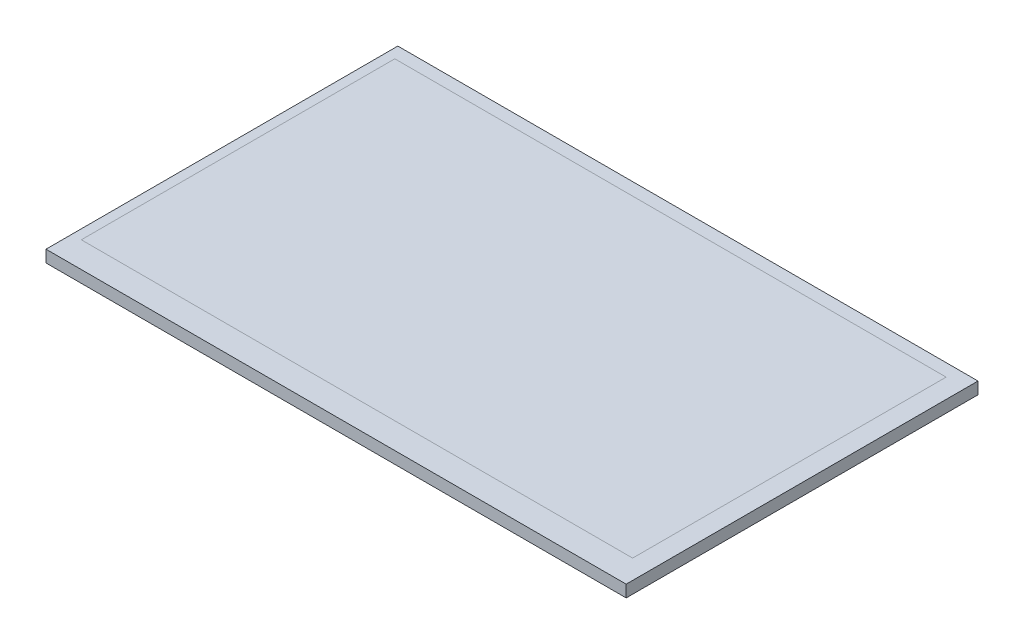
ISO-10303-21;
HEADER;
FILE_DESCRIPTION(('STEP AP214'),'2;1');
FILE_NAME('part.step','',(''),(''),'','','');
FILE_SCHEMA(('AUTOMOTIVE_DESIGN { 1 0 10303 214 1 1 1 1 }'));
ENDSEC;
DATA;
#1=APPLICATION_CONTEXT('core data for automotive mechanical design processes');
#2=APPLICATION_PROTOCOL_DEFINITION('international standard','automotive_design',2000,#1);
#3=PRODUCT_CONTEXT('',#1,'mechanical');
#4=PRODUCT('Part','Part','',(#3));
#5=PRODUCT_RELATED_PRODUCT_CATEGORY('part','',(#4));
#6=PRODUCT_DEFINITION_FORMATION('','',#4);
#7=PRODUCT_DEFINITION_CONTEXT('part definition',#1,'design');
#8=PRODUCT_DEFINITION('design','',#6,#7);
#9=PRODUCT_DEFINITION_SHAPE('','',#8);
#10=(LENGTH_UNIT() NAMED_UNIT(*) SI_UNIT(.MILLI.,.METRE.));
#11=(NAMED_UNIT(*) PLANE_ANGLE_UNIT() SI_UNIT($,.RADIAN.));
#12=(NAMED_UNIT(*) SI_UNIT($,.STERADIAN.) SOLID_ANGLE_UNIT());
#13=UNCERTAINTY_MEASURE_WITH_UNIT(LENGTH_MEASURE(1.E-05),#10,'distance_accuracy_value','');
#14=(GEOMETRIC_REPRESENTATION_CONTEXT(3) GLOBAL_UNCERTAINTY_ASSIGNED_CONTEXT((#13)) GLOBAL_UNIT_ASSIGNED_CONTEXT((#10,
#11,#12)) REPRESENTATION_CONTEXT('',''));
#15=CARTESIAN_POINT('',(0.,0.,0.));
#16=DIRECTION('',(0.,0.,1.));
#17=DIRECTION('',(1.,0.,0.));
#18=AXIS2_PLACEMENT_3D('',#15,#16,#17);
#19=CARTESIAN_POINT('',(0.,3.4,0.));
#20=DIRECTION('',(0.,1.,0.));
#21=DIRECTION('',(0.,0.,1.));
#22=AXIS2_PLACEMENT_3D('',#19,#20,#21);
#23=PLANE('',#22);
#24=DIRECTION('',(0.,0.,-1.));
#25=VECTOR('',#24,1.);
#26=CARTESIAN_POINT('',(82.45,3.4,-50.));
#27=LINE('',#26,#25);
#28=CARTESIAN_POINT('',(82.45,3.4,50.));
#29=VERTEX_POINT('',#28);
#30=CARTESIAN_POINT('',(82.45,3.4,-50.));
#31=VERTEX_POINT('',#30);
#32=EDGE_CURVE('E99',#29,#31,#27,.T.);
#33=ORIENTED_EDGE('',*,*,#32,.T.);
#34=DIRECTION('',(-1.,0.,0.));
#35=VECTOR('',#34,1.);
#36=CARTESIAN_POINT('',(-82.45,3.4,-50.));
#37=LINE('',#36,#35);
#38=CARTESIAN_POINT('',(-82.45,3.4,-50.));
#39=VERTEX_POINT('',#38);
#40=EDGE_CURVE('E88',#31,#39,#37,.T.);
#41=ORIENTED_EDGE('',*,*,#40,.T.);
#42=DIRECTION('',(0.,0.,1.));
#43=VECTOR('',#42,1.);
#44=CARTESIAN_POINT('',(-82.45,3.4,-50.));
#45=LINE('',#44,#43);
#46=CARTESIAN_POINT('',(-82.45,3.4,50.));
#47=VERTEX_POINT('',#46);
#48=EDGE_CURVE('E98',#39,#47,#45,.T.);
#49=ORIENTED_EDGE('',*,*,#48,.T.);
#50=DIRECTION('',(1.,0.,0.));
#51=VECTOR('',#50,1.);
#52=CARTESIAN_POINT('',(-82.45,3.4,50.));
#53=LINE('',#52,#51);
#54=EDGE_CURVE('E104',#47,#29,#53,.T.);
#55=ORIENTED_EDGE('',*,*,#54,.T.);
#56=EDGE_LOOP('',(#33,#41,#49,#55));
#57=FACE_BOUND('',#56,.T.);
#58=DIRECTION('',(1.,0.,0.));
#59=VECTOR('',#58,1.);
#60=CARTESIAN_POINT('',(0.,3.4,-46.43));
#61=LINE('',#60,#59);
#62=CARTESIAN_POINT('',(-79.74,3.4,-46.43));
#63=VERTEX_POINT('',#62);
#64=CARTESIAN_POINT('',(76.96,3.4,-46.43));
#65=VERTEX_POINT('',#64);
#66=EDGE_CURVE('E48',#63,#65,#61,.T.);
#67=ORIENTED_EDGE('',*,*,#66,.T.);
#68=DIRECTION('',(0.,0.,1.));
#69=VECTOR('',#68,1.);
#70=CARTESIAN_POINT('',(76.96,3.4,0.));
#71=LINE('',#70,#69);
#72=CARTESIAN_POINT('',(76.96,3.4,42.67));
#73=VERTEX_POINT('',#72);
#74=EDGE_CURVE('E11',#65,#73,#71,.T.);
#75=ORIENTED_EDGE('',*,*,#74,.T.);
#76=DIRECTION('',(-1.,0.,0.));
#77=VECTOR('',#76,1.);
#78=CARTESIAN_POINT('',(0.,3.4,42.67));
#79=LINE('',#78,#77);
#80=CARTESIAN_POINT('',(-79.74,3.4,42.67));
#81=VERTEX_POINT('',#80);
#82=EDGE_CURVE('E112',#73,#81,#79,.T.);
#83=ORIENTED_EDGE('',*,*,#82,.T.);
#84=DIRECTION('',(0.,0.,-1.));
#85=VECTOR('',#84,1.);
#86=CARTESIAN_POINT('',(-79.74,3.4,0.));
#87=LINE('',#86,#85);
#88=EDGE_CURVE('E116',#81,#63,#87,.T.);
#89=ORIENTED_EDGE('',*,*,#88,.T.);
#90=EDGE_LOOP('',(#67,#75,#83,#89));
#91=FACE_BOUND('',#90,.T.);
#92=ADVANCED_FACE('F39',(#57,#91),#23,.T.);
#93=CARTESIAN_POINT('',(82.45,3.4,-50.));
#94=DIRECTION('',(-1.,0.,0.));
#95=DIRECTION('',(0.,0.,1.));
#96=AXIS2_PLACEMENT_3D('',#93,#94,#95);
#97=PLANE('',#96);
#98=DIRECTION('',(0.,0.,-1.));
#99=VECTOR('',#98,1.);
#100=CARTESIAN_POINT('',(82.45,0.,-50.));
#101=LINE('',#100,#99);
#102=CARTESIAN_POINT('',(82.45,0.,50.));
#103=VERTEX_POINT('',#102);
#104=CARTESIAN_POINT('',(82.45,0.,-50.));
#105=VERTEX_POINT('',#104);
#106=EDGE_CURVE('E111',#103,#105,#101,.T.);
#107=ORIENTED_EDGE('',*,*,#106,.T.);
#108=DIRECTION('',(0.,-1.,0.));
#109=VECTOR('',#108,1.);
#110=CARTESIAN_POINT('',(82.45,3.4,-50.));
#111=LINE('',#110,#109);
#112=EDGE_CURVE('E92',#31,#105,#111,.T.);
#113=ORIENTED_EDGE('',*,*,#112,.F.);
#114=ORIENTED_EDGE('',*,*,#32,.F.);
#115=DIRECTION('',(0.,-1.,0.));
#116=VECTOR('',#115,1.);
#117=CARTESIAN_POINT('',(82.45,3.4,50.));
#118=LINE('',#117,#116);
#119=EDGE_CURVE('E161',#29,#103,#118,.T.);
#120=ORIENTED_EDGE('',*,*,#119,.T.);
#121=EDGE_LOOP('',(#107,#113,#114,#120));
#122=FACE_BOUND('',#121,.T.);
#123=ADVANCED_FACE('F41',(#122),#97,.F.);
#124=CARTESIAN_POINT('',(-82.45,3.4,-50.));
#125=DIRECTION('',(0.,0.,1.));
#126=DIRECTION('',(1.,0.,0.));
#127=AXIS2_PLACEMENT_3D('',#124,#125,#126);
#128=PLANE('',#127);
#129=DIRECTION('',(-1.,0.,0.));
#130=VECTOR('',#129,1.);
#131=CARTESIAN_POINT('',(-82.45,0.,-50.));
#132=LINE('',#131,#130);
#133=CARTESIAN_POINT('',(-82.45,0.,-50.));
#134=VERTEX_POINT('',#133);
#135=EDGE_CURVE('E159',#105,#134,#132,.T.);
#136=ORIENTED_EDGE('',*,*,#135,.T.);
#137=DIRECTION('',(0.,-1.,0.));
#138=VECTOR('',#137,1.);
#139=CARTESIAN_POINT('',(-82.45,3.4,-50.));
#140=LINE('',#139,#138);
#141=EDGE_CURVE('E95',#39,#134,#140,.T.);
#142=ORIENTED_EDGE('',*,*,#141,.F.);
#143=ORIENTED_EDGE('',*,*,#40,.F.);
#144=ORIENTED_EDGE('',*,*,#112,.T.);
#145=EDGE_LOOP('',(#136,#142,#143,#144));
#146=FACE_BOUND('',#145,.T.);
#147=ADVANCED_FACE('F90',(#146),#128,.F.);
#148=CARTESIAN_POINT('',(-82.45,3.4,-50.));
#149=DIRECTION('',(1.,0.,0.));
#150=DIRECTION('',(0.,0.,-1.));
#151=AXIS2_PLACEMENT_3D('',#148,#149,#150);
#152=PLANE('',#151);
#153=DIRECTION('',(0.,0.,1.));
#154=VECTOR('',#153,1.);
#155=CARTESIAN_POINT('',(-82.45,0.,-50.));
#156=LINE('',#155,#154);
#157=CARTESIAN_POINT('',(-82.45,0.,50.));
#158=VERTEX_POINT('',#157);
#159=EDGE_CURVE('E156',#134,#158,#156,.T.);
#160=ORIENTED_EDGE('',*,*,#159,.T.);
#161=DIRECTION('',(0.,-1.,0.));
#162=VECTOR('',#161,1.);
#163=CARTESIAN_POINT('',(-82.45,3.4,50.));
#164=LINE('',#163,#162);
#165=EDGE_CURVE('E118',#47,#158,#164,.T.);
#166=ORIENTED_EDGE('',*,*,#165,.F.);
#167=ORIENTED_EDGE('',*,*,#48,.F.);
#168=ORIENTED_EDGE('',*,*,#141,.T.);
#169=EDGE_LOOP('',(#160,#166,#167,#168));
#170=FACE_BOUND('',#169,.T.);
#171=ADVANCED_FACE('F137',(#170),#152,.F.);
#172=CARTESIAN_POINT('',(-82.45,3.4,50.));
#173=DIRECTION('',(0.,0.,-1.));
#174=DIRECTION('',(-1.,0.,0.));
#175=AXIS2_PLACEMENT_3D('',#172,#173,#174);
#176=PLANE('',#175);
#177=DIRECTION('',(1.,0.,0.));
#178=VECTOR('',#177,1.);
#179=CARTESIAN_POINT('',(-82.45,0.,50.));
#180=LINE('',#179,#178);
#181=EDGE_CURVE('E108',#158,#103,#180,.T.);
#182=ORIENTED_EDGE('',*,*,#181,.T.);
#183=ORIENTED_EDGE('',*,*,#119,.F.);
#184=ORIENTED_EDGE('',*,*,#54,.F.);
#185=ORIENTED_EDGE('',*,*,#165,.T.);
#186=EDGE_LOOP('',(#182,#183,#184,#185));
#187=FACE_BOUND('',#186,.T.);
#188=ADVANCED_FACE('F129',(#187),#176,.F.);
#189=ORIENTED_EDGE('',*,*,#74,.F.);
#190=ORIENTED_EDGE('',*,*,#66,.F.);
#191=ORIENTED_EDGE('',*,*,#88,.F.);
#192=ORIENTED_EDGE('',*,*,#82,.F.);
#193=EDGE_LOOP('',(#189,#190,#191,#192));
#194=FACE_BOUND('',#193,.T.);
#195=ADVANCED_FACE('F126',(#194),#23,.T.);
#196=CARTESIAN_POINT('',(0.,0.,0.));
#197=DIRECTION('',(0.,1.,0.));
#198=DIRECTION('',(0.,0.,1.));
#199=AXIS2_PLACEMENT_3D('',#196,#197,#198);
#200=PLANE('',#199);
#201=ORIENTED_EDGE('',*,*,#106,.F.);
#202=ORIENTED_EDGE('',*,*,#181,.F.);
#203=ORIENTED_EDGE('',*,*,#159,.F.);
#204=ORIENTED_EDGE('',*,*,#135,.F.);
#205=EDGE_LOOP('',(#201,#202,#203,#204));
#206=FACE_BOUND('',#205,.T.);
#207=ADVANCED_FACE('F128',(#206),#200,.F.);
#208=CLOSED_SHELL('',(#92,#123,#147,#171,#188,#195,#207));
#209=MANIFOLD_SOLID_BREP('B2',#208);
#210=ADVANCED_BREP_SHAPE_REPRESENTATION('',(#18,#209),#14);
#211=SHAPE_DEFINITION_REPRESENTATION(#9,#210);
ENDSEC;
END-ISO-10303-21;
